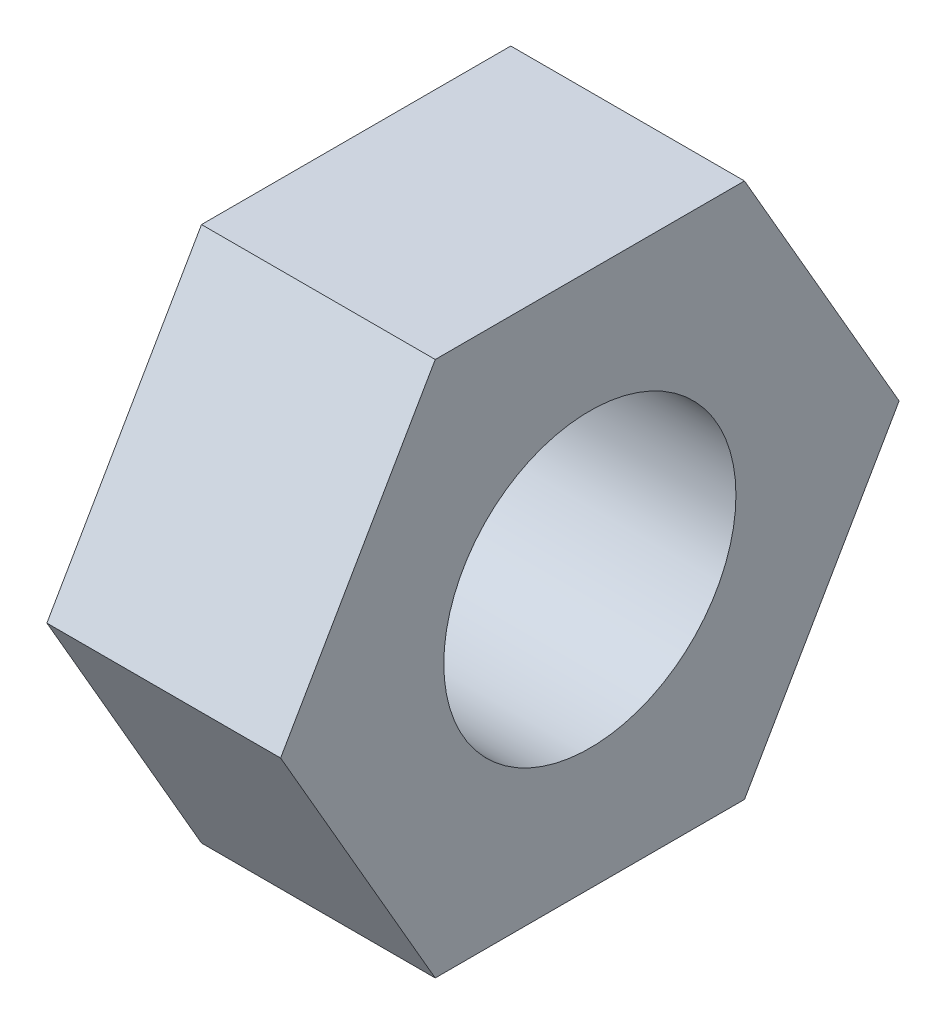
ISO-10303-21;
HEADER;
FILE_DESCRIPTION(('STEP AP214'),'2;1');
FILE_NAME('part.step','',(''),(''),'','','');
FILE_SCHEMA(('AUTOMOTIVE_DESIGN { 1 0 10303 214 1 1 1 1 }'));
ENDSEC;
DATA;
#1=APPLICATION_CONTEXT('core data for automotive mechanical design processes');
#2=APPLICATION_PROTOCOL_DEFINITION('international standard','automotive_design',2000,#1);
#3=PRODUCT_CONTEXT('',#1,'mechanical');
#4=PRODUCT('Part','Part','',(#3));
#5=PRODUCT_RELATED_PRODUCT_CATEGORY('part','',(#4));
#6=PRODUCT_DEFINITION_FORMATION('','',#4);
#7=PRODUCT_DEFINITION_CONTEXT('part definition',#1,'design');
#8=PRODUCT_DEFINITION('design','',#6,#7);
#9=PRODUCT_DEFINITION_SHAPE('','',#8);
#10=(LENGTH_UNIT() NAMED_UNIT(*) SI_UNIT(.MILLI.,.METRE.));
#11=(NAMED_UNIT(*) PLANE_ANGLE_UNIT() SI_UNIT($,.RADIAN.));
#12=(NAMED_UNIT(*) SI_UNIT($,.STERADIAN.) SOLID_ANGLE_UNIT());
#13=UNCERTAINTY_MEASURE_WITH_UNIT(LENGTH_MEASURE(1.E-05),#10,'distance_accuracy_value','');
#14=(GEOMETRIC_REPRESENTATION_CONTEXT(3) GLOBAL_UNCERTAINTY_ASSIGNED_CONTEXT((#13)) GLOBAL_UNIT_ASSIGNED_CONTEXT((#10,
#11,#12)) REPRESENTATION_CONTEXT('',''));
#15=CARTESIAN_POINT('',(0.,0.,0.));
#16=DIRECTION('',(0.,0.,1.));
#17=DIRECTION('',(1.,0.,0.));
#18=AXIS2_PLACEMENT_3D('',#15,#16,#17);
#19=CARTESIAN_POINT('',(2.4,-2.75,-1.58771324027147));
#20=DIRECTION('',(0.,0.5,0.866025403784439));
#21=DIRECTION('',(0.,-0.866025403784439,0.5));
#22=AXIS2_PLACEMENT_3D('',#19,#20,#21);
#23=PLANE('',#22);
#24=DIRECTION('',(0.,0.866025403784439,-0.5));
#25=VECTOR('',#24,1.);
#26=CARTESIAN_POINT('',(0.,-2.75,-1.58771324027147));
#27=LINE('',#26,#25);
#28=CARTESIAN_POINT('',(0.,-2.75,-1.58771324027147));
#29=VERTEX_POINT('',#28);
#30=CARTESIAN_POINT('',(0.,0.,-3.17542648054294));
#31=VERTEX_POINT('',#30);
#32=EDGE_CURVE('E129',#29,#31,#27,.T.);
#33=ORIENTED_EDGE('',*,*,#32,.T.);
#34=DIRECTION('',(-1.,0.,0.));
#35=VECTOR('',#34,1.);
#36=CARTESIAN_POINT('',(2.4,0.,-3.17542648054294));
#37=LINE('',#36,#35);
#38=CARTESIAN_POINT('',(2.4,0.,-3.17542648054294));
#39=VERTEX_POINT('',#38);
#40=EDGE_CURVE('E11',#39,#31,#37,.T.);
#41=ORIENTED_EDGE('',*,*,#40,.F.);
#42=DIRECTION('',(0.,0.866025403784439,-0.5));
#43=VECTOR('',#42,1.);
#44=CARTESIAN_POINT('',(2.4,-2.75,-1.58771324027147));
#45=LINE('',#44,#43);
#46=CARTESIAN_POINT('',(2.4,-2.75,-1.58771324027147));
#47=VERTEX_POINT('',#46);
#48=EDGE_CURVE('E139',#47,#39,#45,.T.);
#49=ORIENTED_EDGE('',*,*,#48,.F.);
#50=DIRECTION('',(-1.,0.,0.));
#51=VECTOR('',#50,1.);
#52=CARTESIAN_POINT('',(2.4,-2.75,-1.58771324027147));
#53=LINE('',#52,#51);
#54=EDGE_CURVE('E125',#47,#29,#53,.T.);
#55=ORIENTED_EDGE('',*,*,#54,.T.);
#56=EDGE_LOOP('',(#33,#41,#49,#55));
#57=FACE_BOUND('',#56,.T.);
#58=ADVANCED_FACE('F41',(#57),#23,.F.);
#59=CARTESIAN_POINT('',(2.4,0.,-3.17542648054294));
#60=DIRECTION('',(0.,-0.5,0.866025403784439));
#61=DIRECTION('',(0.,-0.866025403784439,-0.5));
#62=AXIS2_PLACEMENT_3D('',#59,#60,#61);
#63=PLANE('',#62);
#64=DIRECTION('',(0.,0.866025403784439,0.5));
#65=VECTOR('',#64,1.);
#66=CARTESIAN_POINT('',(0.,0.,-3.17542648054294));
#67=LINE('',#66,#65);
#68=CARTESIAN_POINT('',(0.,2.75,-1.58771324027147));
#69=VERTEX_POINT('',#68);
#70=EDGE_CURVE('E128',#31,#69,#67,.T.);
#71=ORIENTED_EDGE('',*,*,#70,.T.);
#72=DIRECTION('',(-1.,0.,0.));
#73=VECTOR('',#72,1.);
#74=CARTESIAN_POINT('',(2.4,2.75,-1.58771324027147));
#75=LINE('',#74,#73);
#76=CARTESIAN_POINT('',(2.4,2.75,-1.58771324027147));
#77=VERTEX_POINT('',#76);
#78=EDGE_CURVE('E49',#77,#69,#75,.T.);
#79=ORIENTED_EDGE('',*,*,#78,.F.);
#80=DIRECTION('',(0.,0.866025403784439,0.5));
#81=VECTOR('',#80,1.);
#82=CARTESIAN_POINT('',(2.4,0.,-3.17542648054294));
#83=LINE('',#82,#81);
#84=EDGE_CURVE('E91',#39,#77,#83,.T.);
#85=ORIENTED_EDGE('',*,*,#84,.F.);
#86=ORIENTED_EDGE('',*,*,#40,.T.);
#87=EDGE_LOOP('',(#71,#79,#85,#86));
#88=FACE_BOUND('',#87,.T.);
#89=ADVANCED_FACE('F161',(#88),#63,.F.);
#90=CARTESIAN_POINT('',(2.4,2.75,-1.58771324027147));
#91=DIRECTION('',(0.,-1.,0.));
#92=DIRECTION('',(0.,0.,-1.));
#93=AXIS2_PLACEMENT_3D('',#90,#91,#92);
#94=PLANE('',#93);
#95=DIRECTION('',(0.,0.,1.));
#96=VECTOR('',#95,1.);
#97=CARTESIAN_POINT('',(0.,2.75,-1.58771324027147));
#98=LINE('',#97,#96);
#99=CARTESIAN_POINT('',(0.,2.75,1.58771324027147));
#100=VERTEX_POINT('',#99);
#101=EDGE_CURVE('E132',#69,#100,#98,.T.);
#102=ORIENTED_EDGE('',*,*,#101,.T.);
#103=DIRECTION('',(-1.,0.,0.));
#104=VECTOR('',#103,1.);
#105=CARTESIAN_POINT('',(2.4,2.75,1.58771324027147));
#106=LINE('',#105,#104);
#107=CARTESIAN_POINT('',(2.4,2.75,1.58771324027147));
#108=VERTEX_POINT('',#107);
#109=EDGE_CURVE('E120',#108,#100,#106,.T.);
#110=ORIENTED_EDGE('',*,*,#109,.F.);
#111=DIRECTION('',(0.,0.,1.));
#112=VECTOR('',#111,1.);
#113=CARTESIAN_POINT('',(2.4,2.75,-1.58771324027147));
#114=LINE('',#113,#112);
#115=EDGE_CURVE('E108',#77,#108,#114,.T.);
#116=ORIENTED_EDGE('',*,*,#115,.F.);
#117=ORIENTED_EDGE('',*,*,#78,.T.);
#118=EDGE_LOOP('',(#102,#110,#116,#117));
#119=FACE_BOUND('',#118,.T.);
#120=ADVANCED_FACE('F144',(#119),#94,.F.);
#121=CARTESIAN_POINT('',(2.4,2.75,1.58771324027147));
#122=DIRECTION('',(0.,-0.5,-0.866025403784439));
#123=DIRECTION('',(0.,0.866025403784439,-0.5));
#124=AXIS2_PLACEMENT_3D('',#121,#122,#123);
#125=PLANE('',#124);
#126=DIRECTION('',(0.,-0.866025403784438,0.5));
#127=VECTOR('',#126,1.);
#128=CARTESIAN_POINT('',(0.,2.75,1.58771324027147));
#129=LINE('',#128,#127);
#130=CARTESIAN_POINT('',(0.,0.,3.17542648054294));
#131=VERTEX_POINT('',#130);
#132=EDGE_CURVE('E116',#100,#131,#129,.T.);
#133=ORIENTED_EDGE('',*,*,#132,.T.);
#134=DIRECTION('',(-1.,0.,0.));
#135=VECTOR('',#134,1.);
#136=CARTESIAN_POINT('',(2.4,0.,3.17542648054294));
#137=LINE('',#136,#135);
#138=CARTESIAN_POINT('',(2.4,0.,3.17542648054294));
#139=VERTEX_POINT('',#138);
#140=EDGE_CURVE('E113',#139,#131,#137,.T.);
#141=ORIENTED_EDGE('',*,*,#140,.F.);
#142=DIRECTION('',(0.,-0.866025403784438,0.5));
#143=VECTOR('',#142,1.);
#144=CARTESIAN_POINT('',(2.4,2.75,1.58771324027147));
#145=LINE('',#144,#143);
#146=EDGE_CURVE('E105',#108,#139,#145,.T.);
#147=ORIENTED_EDGE('',*,*,#146,.F.);
#148=ORIENTED_EDGE('',*,*,#109,.T.);
#149=EDGE_LOOP('',(#133,#141,#147,#148));
#150=FACE_BOUND('',#149,.T.);
#151=ADVANCED_FACE('F112',(#150),#125,.F.);
#152=CARTESIAN_POINT('',(2.4,0.,3.17542648054294));
#153=DIRECTION('',(0.,0.5,-0.866025403784439));
#154=DIRECTION('',(0.,0.866025403784439,0.5));
#155=AXIS2_PLACEMENT_3D('',#152,#153,#154);
#156=PLANE('',#155);
#157=DIRECTION('',(0.,-0.866025403784439,-0.5));
#158=VECTOR('',#157,1.);
#159=CARTESIAN_POINT('',(0.,0.,3.17542648054294));
#160=LINE('',#159,#158);
#161=CARTESIAN_POINT('',(0.,-2.75,1.58771324027147));
#162=VERTEX_POINT('',#161);
#163=EDGE_CURVE('E84',#131,#162,#160,.T.);
#164=ORIENTED_EDGE('',*,*,#163,.T.);
#165=DIRECTION('',(-1.,0.,0.));
#166=VECTOR('',#165,1.);
#167=CARTESIAN_POINT('',(2.4,-2.75,1.58771324027147));
#168=LINE('',#167,#166);
#169=CARTESIAN_POINT('',(2.4,-2.75,1.58771324027147));
#170=VERTEX_POINT('',#169);
#171=EDGE_CURVE('E117',#170,#162,#168,.T.);
#172=ORIENTED_EDGE('',*,*,#171,.F.);
#173=DIRECTION('',(0.,-0.866025403784439,-0.5));
#174=VECTOR('',#173,1.);
#175=CARTESIAN_POINT('',(2.4,0.,3.17542648054294));
#176=LINE('',#175,#174);
#177=EDGE_CURVE('E106',#139,#170,#176,.T.);
#178=ORIENTED_EDGE('',*,*,#177,.F.);
#179=ORIENTED_EDGE('',*,*,#140,.T.);
#180=EDGE_LOOP('',(#164,#172,#178,#179));
#181=FACE_BOUND('',#180,.T.);
#182=ADVANCED_FACE('F119',(#181),#156,.F.);
#183=CARTESIAN_POINT('',(2.4,-2.75,1.58771324027147));
#184=DIRECTION('',(0.,1.,0.));
#185=DIRECTION('',(0.,0.,1.));
#186=AXIS2_PLACEMENT_3D('',#183,#184,#185);
#187=PLANE('',#186);
#188=DIRECTION('',(0.,0.,-1.));
#189=VECTOR('',#188,1.);
#190=CARTESIAN_POINT('',(0.,-2.75,1.58771324027147));
#191=LINE('',#190,#189);
#192=EDGE_CURVE('E87',#162,#29,#191,.T.);
#193=ORIENTED_EDGE('',*,*,#192,.T.);
#194=ORIENTED_EDGE('',*,*,#54,.F.);
#195=DIRECTION('',(0.,0.,-1.));
#196=VECTOR('',#195,1.);
#197=CARTESIAN_POINT('',(2.4,-2.75,1.58771324027147));
#198=LINE('',#197,#196);
#199=EDGE_CURVE('E59',#170,#47,#198,.T.);
#200=ORIENTED_EDGE('',*,*,#199,.F.);
#201=ORIENTED_EDGE('',*,*,#171,.T.);
#202=EDGE_LOOP('',(#193,#194,#200,#201));
#203=FACE_BOUND('',#202,.T.);
#204=ADVANCED_FACE('F151',(#203),#187,.F.);
#205=CARTESIAN_POINT('',(2.4,0.,0.));
#206=DIRECTION('',(1.,0.,0.));
#207=DIRECTION('',(0.,0.,-1.));
#208=AXIS2_PLACEMENT_3D('',#205,#206,#207);
#209=PLANE('',#208);
#210=CARTESIAN_POINT('',(2.39999999999996,0.,0.));
#211=DIRECTION('',(1.,0.,0.));
#212=DIRECTION('',(0.,0.,-1.));
#213=AXIS2_PLACEMENT_3D('',#210,#211,#212);
#214=CIRCLE('',#213,1.5);
#215=CARTESIAN_POINT('',(2.39999999999996,0.,-1.5));
#216=VERTEX_POINT('',#215);
#217=EDGE_CURVE('E127',#216,#216,#214,.F.);
#218=ORIENTED_EDGE('',*,*,#217,.T.);
#219=EDGE_LOOP('',(#218));
#220=FACE_BOUND('',#219,.T.);
#221=ORIENTED_EDGE('',*,*,#48,.T.);
#222=ORIENTED_EDGE('',*,*,#84,.T.);
#223=ORIENTED_EDGE('',*,*,#115,.T.);
#224=ORIENTED_EDGE('',*,*,#146,.T.);
#225=ORIENTED_EDGE('',*,*,#177,.T.);
#226=ORIENTED_EDGE('',*,*,#199,.T.);
#227=EDGE_LOOP('',(#221,#222,#223,#224,#225,#226));
#228=FACE_BOUND('',#227,.T.);
#229=ADVANCED_FACE('F104',(#220,#228),#209,.T.);
#230=CARTESIAN_POINT('',(0.,0.,0.));
#231=DIRECTION('',(1.,0.,0.));
#232=DIRECTION('',(0.,0.,-1.));
#233=AXIS2_PLACEMENT_3D('',#230,#231,#232);
#234=PLANE('',#233);
#235=CARTESIAN_POINT('',(0.,0.,0.));
#236=DIRECTION('',(1.,0.,0.));
#237=DIRECTION('',(0.,0.,-1.));
#238=AXIS2_PLACEMENT_3D('',#235,#236,#237);
#239=CIRCLE('',#238,1.5);
#240=CARTESIAN_POINT('',(0.,0.,-1.5));
#241=VERTEX_POINT('',#240);
#242=EDGE_CURVE('E42',#241,#241,#239,.F.);
#243=ORIENTED_EDGE('',*,*,#242,.F.);
#244=EDGE_LOOP('',(#243));
#245=FACE_BOUND('',#244,.T.);
#246=ORIENTED_EDGE('',*,*,#32,.F.);
#247=ORIENTED_EDGE('',*,*,#192,.F.);
#248=ORIENTED_EDGE('',*,*,#163,.F.);
#249=ORIENTED_EDGE('',*,*,#132,.F.);
#250=ORIENTED_EDGE('',*,*,#101,.F.);
#251=ORIENTED_EDGE('',*,*,#70,.F.);
#252=EDGE_LOOP('',(#246,#247,#248,#249,#250,#251));
#253=FACE_BOUND('',#252,.T.);
#254=ADVANCED_FACE('F146',(#245,#253),#234,.F.);
#255=CARTESIAN_POINT('',(-1000.,0.,0.));
#256=DIRECTION('',(-1.,0.,0.));
#257=DIRECTION('',(0.,0.,1.));
#258=AXIS2_PLACEMENT_3D('',#255,#256,#257);
#259=CYLINDRICAL_SURFACE('',#258,1.5);
#260=ORIENTED_EDGE('',*,*,#217,.F.);
#261=EDGE_LOOP('',(#260));
#262=FACE_BOUND('',#261,.T.);
#263=ORIENTED_EDGE('',*,*,#242,.T.);
#264=EDGE_LOOP('',(#263));
#265=FACE_BOUND('',#264,.T.);
#266=ADVANCED_FACE('F204',(#262,#265),#259,.F.);
#267=CLOSED_SHELL('',(#58,#89,#120,#151,#182,#204,#229,#254,#266));
#268=MANIFOLD_SOLID_BREP('B2',#267);
#269=ADVANCED_BREP_SHAPE_REPRESENTATION('',(#18,#268),#14);
#270=SHAPE_DEFINITION_REPRESENTATION(#9,#269);
ENDSEC;
END-ISO-10303-21;
